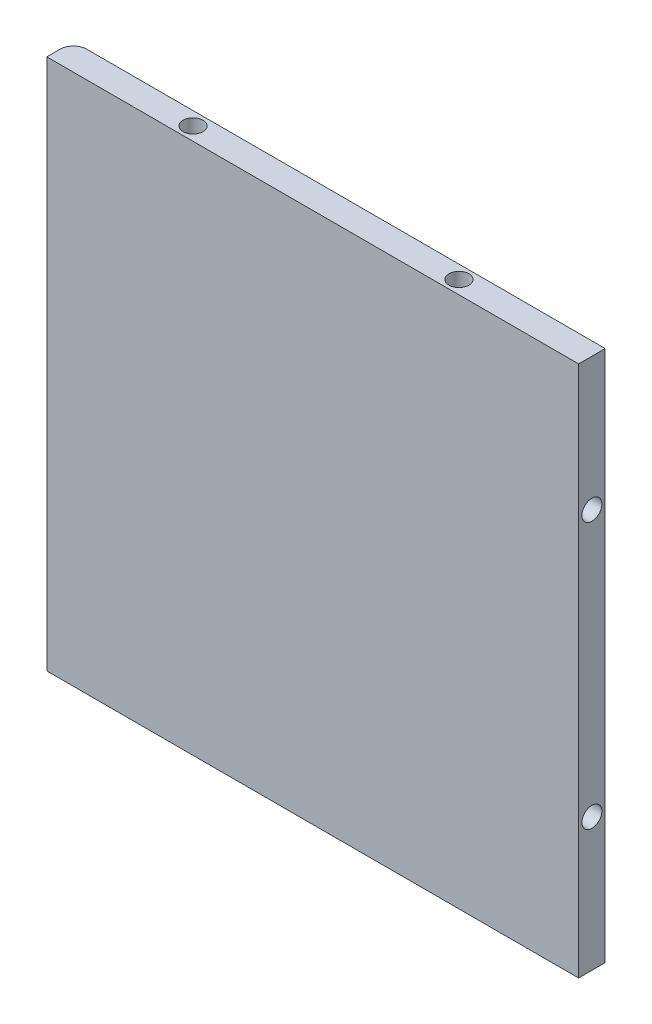
ISO-10303-21;
HEADER;
FILE_DESCRIPTION(('STEP AP214'),'2;1');
FILE_NAME('part.step','',(''),(''),'','','');
FILE_SCHEMA(('AUTOMOTIVE_DESIGN { 1 0 10303 214 1 1 1 1 }'));
ENDSEC;
DATA;
#1=APPLICATION_CONTEXT('core data for automotive mechanical design processes');
#2=APPLICATION_PROTOCOL_DEFINITION('international standard','automotive_design',2000,#1);
#3=PRODUCT_CONTEXT('',#1,'mechanical');
#4=PRODUCT('Part','Part','',(#3));
#5=PRODUCT_RELATED_PRODUCT_CATEGORY('part','',(#4));
#6=PRODUCT_DEFINITION_FORMATION('','',#4);
#7=PRODUCT_DEFINITION_CONTEXT('part definition',#1,'design');
#8=PRODUCT_DEFINITION('design','',#6,#7);
#9=PRODUCT_DEFINITION_SHAPE('','',#8);
#10=(LENGTH_UNIT() NAMED_UNIT(*) SI_UNIT(.MILLI.,.METRE.));
#11=(NAMED_UNIT(*) PLANE_ANGLE_UNIT() SI_UNIT($,.RADIAN.));
#12=(NAMED_UNIT(*) SI_UNIT($,.STERADIAN.) SOLID_ANGLE_UNIT());
#13=UNCERTAINTY_MEASURE_WITH_UNIT(LENGTH_MEASURE(1.E-05),#10,'distance_accuracy_value','');
#14=(GEOMETRIC_REPRESENTATION_CONTEXT(3) GLOBAL_UNCERTAINTY_ASSIGNED_CONTEXT((#13)) GLOBAL_UNIT_ASSIGNED_CONTEXT((#10,
#11,#12)) REPRESENTATION_CONTEXT('',''));
#15=CARTESIAN_POINT('',(0.,0.,0.));
#16=DIRECTION('',(0.,0.,1.));
#17=DIRECTION('',(1.,0.,0.));
#18=AXIS2_PLACEMENT_3D('',#15,#16,#17);
#19=CARTESIAN_POINT('',(80.,0.,-110.));
#20=DIRECTION('',(0.,0.,-1.));
#21=DIRECTION('',(0.,1.,0.));
#22=AXIS2_PLACEMENT_3D('',#19,#20,#21);
#23=PLANE('',#22);
#24=DIRECTION('',(-1.,0.,0.));
#25=VECTOR('',#24,1.);
#26=CARTESIAN_POINT('',(0.,38.,-110.));
#27=LINE('',#26,#25);
#28=CARTESIAN_POINT('',(40.,38.,-110.));
#29=VERTEX_POINT('',#28);
#30=CARTESIAN_POINT('',(1.,38.,-110.));
#31=VERTEX_POINT('',#30);
#32=EDGE_CURVE('E96',#29,#31,#27,.T.);
#33=ORIENTED_EDGE('',*,*,#32,.T.);
#34=DIRECTION('',(0.,-1.,0.));
#35=VECTOR('',#34,1.);
#36=CARTESIAN_POINT('',(1.,108.,-110.));
#37=LINE('',#36,#35);
#38=CARTESIAN_POINT('',(1.,78.,-110.));
#39=VERTEX_POINT('',#38);
#40=EDGE_CURVE('E100',#31,#39,#37,.F.);
#41=ORIENTED_EDGE('',*,*,#40,.T.);
#42=DIRECTION('',(1.,0.,0.));
#43=VECTOR('',#42,1.);
#44=CARTESIAN_POINT('',(0.,78.,-110.));
#45=LINE('',#44,#43);
#46=CARTESIAN_POINT('',(40.,78.,-110.));
#47=VERTEX_POINT('',#46);
#48=EDGE_CURVE('E54',#39,#47,#45,.T.);
#49=ORIENTED_EDGE('',*,*,#48,.T.);
#50=DIRECTION('',(0.,-1.,0.));
#51=VECTOR('',#50,1.);
#52=CARTESIAN_POINT('',(40.,0.,-110.));
#53=LINE('',#52,#51);
#54=EDGE_CURVE('E91',#47,#29,#53,.T.);
#55=ORIENTED_EDGE('',*,*,#54,.T.);
#56=EDGE_LOOP('',(#33,#41,#49,#55));
#57=FACE_BOUND('',#56,.T.);
#58=ADVANCED_FACE('F39',(#57),#23,.T.);
#59=CARTESIAN_POINT('',(80.,0.,-108.));
#60=DIRECTION('',(0.,0.,1.));
#61=DIRECTION('',(1.,0.,0.));
#62=AXIS2_PLACEMENT_3D('',#59,#60,#61);
#63=PLANE('',#62);
#64=DIRECTION('',(-1.,0.,0.));
#65=VECTOR('',#64,1.);
#66=CARTESIAN_POINT('',(80.,38.,-108.));
#67=LINE('',#66,#65);
#68=CARTESIAN_POINT('',(40.,38.,-108.));
#69=VERTEX_POINT('',#68);
#70=CARTESIAN_POINT('',(0.,38.,-108.));
#71=VERTEX_POINT('',#70);
#72=EDGE_CURVE('E117',#69,#71,#67,.T.);
#73=ORIENTED_EDGE('',*,*,#72,.F.);
#74=DIRECTION('',(0.,-1.,0.));
#75=VECTOR('',#74,1.);
#76=CARTESIAN_POINT('',(40.,0.,-108.));
#77=LINE('',#76,#75);
#78=CARTESIAN_POINT('',(40.,78.,-108.));
#79=VERTEX_POINT('',#78);
#80=EDGE_CURVE('E11',#79,#69,#77,.T.);
#81=ORIENTED_EDGE('',*,*,#80,.F.);
#82=DIRECTION('',(1.,0.,0.));
#83=VECTOR('',#82,1.);
#84=CARTESIAN_POINT('',(80.,78.,-108.));
#85=LINE('',#84,#83);
#86=CARTESIAN_POINT('',(0.,78.,-108.));
#87=VERTEX_POINT('',#86);
#88=EDGE_CURVE('E86',#87,#79,#85,.T.);
#89=ORIENTED_EDGE('',*,*,#88,.F.);
#90=DIRECTION('',(0.,1.,0.));
#91=VECTOR('',#90,1.);
#92=CARTESIAN_POINT('',(0.,0.,-108.));
#93=LINE('',#92,#91);
#94=EDGE_CURVE('E119',#71,#87,#93,.T.);
#95=ORIENTED_EDGE('',*,*,#94,.F.);
#96=EDGE_LOOP('',(#73,#81,#89,#95));
#97=FACE_BOUND('',#96,.T.);
#98=ADVANCED_FACE('F138',(#97),#63,.T.);
#99=CARTESIAN_POINT('',(0.,0.,0.));
#100=DIRECTION('',(1.,0.,0.));
#101=DIRECTION('',(0.,0.,-1.));
#102=AXIS2_PLACEMENT_3D('',#99,#100,#101);
#103=PLANE('',#102);
#104=DIRECTION('',(0.,-1.,0.));
#105=VECTOR('',#104,1.);
#106=CARTESIAN_POINT('',(0.,-1.99999999999999,-109.));
#107=LINE('',#106,#105);
#108=CARTESIAN_POINT('',(0.,78.,-109.));
#109=VERTEX_POINT('',#108);
#110=CARTESIAN_POINT('',(0.,38.,-109.));
#111=VERTEX_POINT('',#110);
#112=EDGE_CURVE('E122',#109,#111,#107,.T.);
#113=ORIENTED_EDGE('',*,*,#112,.T.);
#114=DIRECTION('',(0.,0.,1.));
#115=VECTOR('',#114,1.);
#116=CARTESIAN_POINT('',(0.,38.,-110.));
#117=LINE('',#116,#115);
#118=EDGE_CURVE('E111',#111,#71,#117,.T.);
#119=ORIENTED_EDGE('',*,*,#118,.T.);
#120=ORIENTED_EDGE('',*,*,#94,.T.);
#121=DIRECTION('',(0.,0.,1.));
#122=VECTOR('',#121,1.);
#123=CARTESIAN_POINT('',(0.,78.,-110.));
#124=LINE('',#123,#122);
#125=EDGE_CURVE('E88',#109,#87,#124,.T.);
#126=ORIENTED_EDGE('',*,*,#125,.F.);
#127=EDGE_LOOP('',(#113,#119,#120,#126));
#128=FACE_BOUND('',#127,.T.);
#129=ADVANCED_FACE('F134',(#128),#103,.F.);
#130=CARTESIAN_POINT('',(1.,0.,-109.));
#131=DIRECTION('',(0.,1.,0.));
#132=DIRECTION('',(0.,0.,1.));
#133=AXIS2_PLACEMENT_3D('',#130,#131,#132);
#134=CYLINDRICAL_SURFACE('',#133,1.);
#135=CARTESIAN_POINT('',(1.,38.,-109.));
#136=DIRECTION('',(0.,1.,0.));
#137=DIRECTION('',(0.,0.,1.));
#138=AXIS2_PLACEMENT_3D('',#135,#136,#137);
#139=CIRCLE('',#138,1.);
#140=EDGE_CURVE('E47',#111,#31,#139,.F.);
#141=ORIENTED_EDGE('',*,*,#140,.F.);
#142=ORIENTED_EDGE('',*,*,#112,.F.);
#143=CARTESIAN_POINT('',(1.,78.,-109.));
#144=DIRECTION('',(0.,-1.,0.));
#145=DIRECTION('',(0.,0.,-1.));
#146=AXIS2_PLACEMENT_3D('',#143,#144,#145);
#147=CIRCLE('',#146,1.);
#148=EDGE_CURVE('E126',#39,#109,#147,.F.);
#149=ORIENTED_EDGE('',*,*,#148,.F.);
#150=ORIENTED_EDGE('',*,*,#40,.F.);
#151=EDGE_LOOP('',(#141,#142,#149,#150));
#152=FACE_BOUND('',#151,.T.);
#153=ADVANCED_FACE('F41',(#152),#134,.T.);
#154=CARTESIAN_POINT('',(0.,38.,-110.));
#155=DIRECTION('',(0.,1.,0.));
#156=DIRECTION('',(0.,0.,1.));
#157=AXIS2_PLACEMENT_3D('',#154,#155,#156);
#158=PLANE('',#157);
#159=CARTESIAN_POINT('',(9.99999999999998,38.,-109.));
#160=DIRECTION('',(0.,-1.,0.));
#161=DIRECTION('',(1.,0.,0.));
#162=AXIS2_PLACEMENT_3D('',#159,#160,#161);
#163=CIRCLE('',#162,0.75);
#164=CARTESIAN_POINT('',(10.75,38.,-109.));
#165=VERTEX_POINT('',#164);
#166=EDGE_CURVE('E226',#165,#165,#163,.T.);
#167=ORIENTED_EDGE('',*,*,#166,.F.);
#168=EDGE_LOOP('',(#167));
#169=FACE_BOUND('',#168,.T.);
#170=CARTESIAN_POINT('',(30.,38.,-109.));
#171=DIRECTION('',(0.,-1.,0.));
#172=DIRECTION('',(1.,0.,0.));
#173=AXIS2_PLACEMENT_3D('',#170,#171,#172);
#174=CIRCLE('',#173,0.750000000000002);
#175=CARTESIAN_POINT('',(30.75,38.,-109.));
#176=VERTEX_POINT('',#175);
#177=EDGE_CURVE('E212',#176,#176,#174,.T.);
#178=ORIENTED_EDGE('',*,*,#177,.F.);
#179=EDGE_LOOP('',(#178));
#180=FACE_BOUND('',#179,.T.);
#181=ORIENTED_EDGE('',*,*,#72,.T.);
#182=ORIENTED_EDGE('',*,*,#118,.F.);
#183=ORIENTED_EDGE('',*,*,#140,.T.);
#184=ORIENTED_EDGE('',*,*,#32,.F.);
#185=DIRECTION('',(0.,0.,1.));
#186=VECTOR('',#185,1.);
#187=CARTESIAN_POINT('',(40.,38.,-110.));
#188=LINE('',#187,#186);
#189=EDGE_CURVE('E87',#29,#69,#188,.T.);
#190=ORIENTED_EDGE('',*,*,#189,.T.);
#191=EDGE_LOOP('',(#181,#182,#183,#184,#190));
#192=FACE_BOUND('',#191,.T.);
#193=ADVANCED_FACE('F129',(#169,#180,#192),#158,.F.);
#194=CARTESIAN_POINT('',(40.,0.,-110.));
#195=DIRECTION('',(-1.,0.,0.));
#196=DIRECTION('',(0.,-1.,0.));
#197=AXIS2_PLACEMENT_3D('',#194,#195,#196);
#198=PLANE('',#197);
#199=CARTESIAN_POINT('',(40.,68.,-109.));
#200=DIRECTION('',(1.,0.,0.));
#201=DIRECTION('',(0.,0.,-1.));
#202=AXIS2_PLACEMENT_3D('',#199,#200,#201);
#203=CIRCLE('',#202,0.749999999999999);
#204=CARTESIAN_POINT('',(40.,68.,-109.75));
#205=VERTEX_POINT('',#204);
#206=EDGE_CURVE('E209',#205,#205,#203,.T.);
#207=ORIENTED_EDGE('',*,*,#206,.F.);
#208=EDGE_LOOP('',(#207));
#209=FACE_BOUND('',#208,.T.);
#210=CARTESIAN_POINT('',(40.,48.,-109.));
#211=DIRECTION('',(1.,0.,0.));
#212=DIRECTION('',(0.,0.,-1.));
#213=AXIS2_PLACEMENT_3D('',#210,#211,#212);
#214=CIRCLE('',#213,0.749999999999999);
#215=CARTESIAN_POINT('',(40.,48.,-109.75));
#216=VERTEX_POINT('',#215);
#217=EDGE_CURVE('E215',#216,#216,#214,.T.);
#218=ORIENTED_EDGE('',*,*,#217,.F.);
#219=EDGE_LOOP('',(#218));
#220=FACE_BOUND('',#219,.T.);
#221=ORIENTED_EDGE('',*,*,#80,.T.);
#222=ORIENTED_EDGE('',*,*,#189,.F.);
#223=ORIENTED_EDGE('',*,*,#54,.F.);
#224=DIRECTION('',(0.,0.,1.));
#225=VECTOR('',#224,1.);
#226=CARTESIAN_POINT('',(40.,78.,-110.));
#227=LINE('',#226,#225);
#228=EDGE_CURVE('E82',#47,#79,#227,.T.);
#229=ORIENTED_EDGE('',*,*,#228,.T.);
#230=EDGE_LOOP('',(#221,#222,#223,#229));
#231=FACE_BOUND('',#230,.T.);
#232=ADVANCED_FACE('F92',(#209,#220,#231),#198,.F.);
#233=CARTESIAN_POINT('',(0.,78.,-110.));
#234=DIRECTION('',(0.,-1.,0.));
#235=DIRECTION('',(0.,0.,-1.));
#236=AXIS2_PLACEMENT_3D('',#233,#234,#235);
#237=PLANE('',#236);
#238=CARTESIAN_POINT('',(10.,78.,-109.));
#239=DIRECTION('',(0.,1.,0.));
#240=DIRECTION('',(0.,0.,1.));
#241=AXIS2_PLACEMENT_3D('',#238,#239,#240);
#242=CIRCLE('',#241,0.749999999999999);
#243=CARTESIAN_POINT('',(10.,78.,-108.25));
#244=VERTEX_POINT('',#243);
#245=EDGE_CURVE('E104',#244,#244,#242,.T.);
#246=ORIENTED_EDGE('',*,*,#245,.F.);
#247=EDGE_LOOP('',(#246));
#248=FACE_BOUND('',#247,.T.);
#249=CARTESIAN_POINT('',(30.,78.,-109.));
#250=DIRECTION('',(0.,1.,0.));
#251=DIRECTION('',(0.,0.,1.));
#252=AXIS2_PLACEMENT_3D('',#249,#250,#251);
#253=CIRCLE('',#252,0.750000000000002);
#254=CARTESIAN_POINT('',(30.,78.,-108.25));
#255=VERTEX_POINT('',#254);
#256=EDGE_CURVE('E232',#255,#255,#253,.T.);
#257=ORIENTED_EDGE('',*,*,#256,.F.);
#258=EDGE_LOOP('',(#257));
#259=FACE_BOUND('',#258,.T.);
#260=ORIENTED_EDGE('',*,*,#88,.T.);
#261=ORIENTED_EDGE('',*,*,#228,.F.);
#262=ORIENTED_EDGE('',*,*,#48,.F.);
#263=ORIENTED_EDGE('',*,*,#148,.T.);
#264=ORIENTED_EDGE('',*,*,#125,.T.);
#265=EDGE_LOOP('',(#260,#261,#262,#263,#264));
#266=FACE_BOUND('',#265,.T.);
#267=ADVANCED_FACE('F84',(#248,#259,#266),#237,.F.);
#268=CARTESIAN_POINT('',(30.,73.,-109.));
#269=DIRECTION('',(0.,1.,0.));
#270=DIRECTION('',(0.,0.,1.));
#271=AXIS2_PLACEMENT_3D('',#268,#269,#270);
#272=CYLINDRICAL_SURFACE('',#271,0.750000000000002);
#273=CARTESIAN_POINT('',(30.,73.,-109.));
#274=DIRECTION('',(0.,1.,0.));
#275=DIRECTION('',(0.,0.,1.));
#276=AXIS2_PLACEMENT_3D('',#273,#274,#275);
#277=CIRCLE('',#276,0.750000000000002);
#278=CARTESIAN_POINT('',(30.,73.,-108.25));
#279=VERTEX_POINT('',#278);
#280=EDGE_CURVE('E107',#279,#279,#277,.T.);
#281=ORIENTED_EDGE('',*,*,#280,.F.);
#282=EDGE_LOOP('',(#281));
#283=FACE_BOUND('',#282,.T.);
#284=ORIENTED_EDGE('',*,*,#256,.T.);
#285=EDGE_LOOP('',(#284));
#286=FACE_BOUND('',#285,.T.);
#287=ADVANCED_FACE('F149',(#283,#286),#272,.F.);
#288=CARTESIAN_POINT('',(30.,73.,-109.));
#289=DIRECTION('',(0.,1.,0.));
#290=DIRECTION('',(0.,0.,1.));
#291=AXIS2_PLACEMENT_3D('',#288,#289,#290);
#292=PLANE('',#291);
#293=ORIENTED_EDGE('',*,*,#280,.T.);
#294=EDGE_LOOP('',(#293));
#295=FACE_BOUND('',#294,.T.);
#296=ADVANCED_FACE('F157',(#295),#292,.T.);
#297=CARTESIAN_POINT('',(10.,73.,-109.));
#298=DIRECTION('',(0.,1.,0.));
#299=DIRECTION('',(0.,0.,1.));
#300=AXIS2_PLACEMENT_3D('',#297,#298,#299);
#301=CYLINDRICAL_SURFACE('',#300,0.749999999999999);
#302=CARTESIAN_POINT('',(10.,73.,-109.));
#303=DIRECTION('',(0.,1.,0.));
#304=DIRECTION('',(0.,0.,1.));
#305=AXIS2_PLACEMENT_3D('',#302,#303,#304);
#306=CIRCLE('',#305,0.749999999999999);
#307=CARTESIAN_POINT('',(10.,73.,-108.25));
#308=VERTEX_POINT('',#307);
#309=EDGE_CURVE('E101',#308,#308,#306,.T.);
#310=ORIENTED_EDGE('',*,*,#309,.F.);
#311=EDGE_LOOP('',(#310));
#312=FACE_BOUND('',#311,.T.);
#313=ORIENTED_EDGE('',*,*,#245,.T.);
#314=EDGE_LOOP('',(#313));
#315=FACE_BOUND('',#314,.T.);
#316=ADVANCED_FACE('F160',(#312,#315),#301,.F.);
#317=CARTESIAN_POINT('',(10.,73.,-109.));
#318=DIRECTION('',(0.,1.,0.));
#319=DIRECTION('',(0.,0.,1.));
#320=AXIS2_PLACEMENT_3D('',#317,#318,#319);
#321=PLANE('',#320);
#322=ORIENTED_EDGE('',*,*,#309,.T.);
#323=EDGE_LOOP('',(#322));
#324=FACE_BOUND('',#323,.T.);
#325=ADVANCED_FACE('F167',(#324),#321,.T.);
#326=CARTESIAN_POINT('',(30.,43.,-109.));
#327=DIRECTION('',(0.,-1.,0.));
#328=DIRECTION('',(1.,0.,0.));
#329=AXIS2_PLACEMENT_3D('',#326,#327,#328);
#330=CYLINDRICAL_SURFACE('',#329,0.750000000000002);
#331=CARTESIAN_POINT('',(30.,43.,-109.));
#332=DIRECTION('',(0.,-1.,0.));
#333=DIRECTION('',(1.,0.,0.));
#334=AXIS2_PLACEMENT_3D('',#331,#332,#333);
#335=CIRCLE('',#334,0.750000000000002);
#336=CARTESIAN_POINT('',(30.75,43.,-109.));
#337=VERTEX_POINT('',#336);
#338=EDGE_CURVE('E208',#337,#337,#335,.T.);
#339=ORIENTED_EDGE('',*,*,#338,.F.);
#340=EDGE_LOOP('',(#339));
#341=FACE_BOUND('',#340,.T.);
#342=ORIENTED_EDGE('',*,*,#177,.T.);
#343=EDGE_LOOP('',(#342));
#344=FACE_BOUND('',#343,.T.);
#345=ADVANCED_FACE('F171',(#341,#344),#330,.F.);
#346=CARTESIAN_POINT('',(30.,43.,-109.));
#347=DIRECTION('',(0.,-1.,0.));
#348=DIRECTION('',(1.,0.,0.));
#349=AXIS2_PLACEMENT_3D('',#346,#347,#348);
#350=PLANE('',#349);
#351=ORIENTED_EDGE('',*,*,#338,.T.);
#352=EDGE_LOOP('',(#351));
#353=FACE_BOUND('',#352,.T.);
#354=ADVANCED_FACE('F173',(#353),#350,.T.);
#355=CARTESIAN_POINT('',(9.99999999999998,43.,-109.));
#356=DIRECTION('',(0.,-1.,0.));
#357=DIRECTION('',(1.,0.,0.));
#358=AXIS2_PLACEMENT_3D('',#355,#356,#357);
#359=CYLINDRICAL_SURFACE('',#358,0.75);
#360=CARTESIAN_POINT('',(9.99999999999998,43.,-109.));
#361=DIRECTION('',(0.,-1.,0.));
#362=DIRECTION('',(1.,0.,0.));
#363=AXIS2_PLACEMENT_3D('',#360,#361,#362);
#364=CIRCLE('',#363,0.75);
#365=CARTESIAN_POINT('',(10.75,43.,-109.));
#366=VERTEX_POINT('',#365);
#367=EDGE_CURVE('E223',#366,#366,#364,.T.);
#368=ORIENTED_EDGE('',*,*,#367,.F.);
#369=EDGE_LOOP('',(#368));
#370=FACE_BOUND('',#369,.T.);
#371=ORIENTED_EDGE('',*,*,#166,.T.);
#372=EDGE_LOOP('',(#371));
#373=FACE_BOUND('',#372,.T.);
#374=ADVANCED_FACE('F176',(#370,#373),#359,.F.);
#375=CARTESIAN_POINT('',(9.99999999999998,43.,-109.));
#376=DIRECTION('',(0.,-1.,0.));
#377=DIRECTION('',(1.,0.,0.));
#378=AXIS2_PLACEMENT_3D('',#375,#376,#377);
#379=PLANE('',#378);
#380=ORIENTED_EDGE('',*,*,#367,.T.);
#381=EDGE_LOOP('',(#380));
#382=FACE_BOUND('',#381,.T.);
#383=ADVANCED_FACE('F183',(#382),#379,.T.);
#384=CARTESIAN_POINT('',(35.,48.,-109.));
#385=DIRECTION('',(1.,0.,0.));
#386=DIRECTION('',(0.,0.,-1.));
#387=AXIS2_PLACEMENT_3D('',#384,#385,#386);
#388=CYLINDRICAL_SURFACE('',#387,0.749999999999999);
#389=CARTESIAN_POINT('',(35.,48.,-109.));
#390=DIRECTION('',(1.,0.,0.));
#391=DIRECTION('',(0.,0.,-1.));
#392=AXIS2_PLACEMENT_3D('',#389,#390,#391);
#393=CIRCLE('',#392,0.749999999999999);
#394=CARTESIAN_POINT('',(35.,48.,-109.75));
#395=VERTEX_POINT('',#394);
#396=EDGE_CURVE('E220',#395,#395,#393,.T.);
#397=ORIENTED_EDGE('',*,*,#396,.F.);
#398=EDGE_LOOP('',(#397));
#399=FACE_BOUND('',#398,.T.);
#400=ORIENTED_EDGE('',*,*,#217,.T.);
#401=EDGE_LOOP('',(#400));
#402=FACE_BOUND('',#401,.T.);
#403=ADVANCED_FACE('F187',(#399,#402),#388,.F.);
#404=CARTESIAN_POINT('',(35.,48.,-109.));
#405=DIRECTION('',(1.,0.,0.));
#406=DIRECTION('',(0.,0.,-1.));
#407=AXIS2_PLACEMENT_3D('',#404,#405,#406);
#408=PLANE('',#407);
#409=ORIENTED_EDGE('',*,*,#396,.T.);
#410=EDGE_LOOP('',(#409));
#411=FACE_BOUND('',#410,.T.);
#412=ADVANCED_FACE('F189',(#411),#408,.T.);
#413=CARTESIAN_POINT('',(35.,68.,-109.));
#414=DIRECTION('',(1.,0.,0.));
#415=DIRECTION('',(0.,0.,-1.));
#416=AXIS2_PLACEMENT_3D('',#413,#414,#415);
#417=CYLINDRICAL_SURFACE('',#416,0.749999999999999);
#418=CARTESIAN_POINT('',(35.,68.,-109.));
#419=DIRECTION('',(1.,0.,0.));
#420=DIRECTION('',(0.,0.,-1.));
#421=AXIS2_PLACEMENT_3D('',#418,#419,#420);
#422=CIRCLE('',#421,0.749999999999999);
#423=CARTESIAN_POINT('',(35.,68.,-109.75));
#424=VERTEX_POINT('',#423);
#425=EDGE_CURVE('E207',#424,#424,#422,.T.);
#426=ORIENTED_EDGE('',*,*,#425,.F.);
#427=EDGE_LOOP('',(#426));
#428=FACE_BOUND('',#427,.T.);
#429=ORIENTED_EDGE('',*,*,#206,.T.);
#430=EDGE_LOOP('',(#429));
#431=FACE_BOUND('',#430,.T.);
#432=ADVANCED_FACE('F192',(#428,#431),#417,.F.);
#433=CARTESIAN_POINT('',(35.,68.,-109.));
#434=DIRECTION('',(1.,0.,0.));
#435=DIRECTION('',(0.,0.,-1.));
#436=AXIS2_PLACEMENT_3D('',#433,#434,#435);
#437=PLANE('',#436);
#438=ORIENTED_EDGE('',*,*,#425,.T.);
#439=EDGE_LOOP('',(#438));
#440=FACE_BOUND('',#439,.T.);
#441=ADVANCED_FACE('F199',(#440),#437,.T.);
#442=CLOSED_SHELL('',(#58,#98,#129,#153,#193,#232,#267,#287,#296,#316,#325,#345,#354,#374,#383,
#403,#412,#432,#441));
#443=MANIFOLD_SOLID_BREP('B2',#442);
#444=ADVANCED_BREP_SHAPE_REPRESENTATION('',(#18,#443),#14);
#445=SHAPE_DEFINITION_REPRESENTATION(#9,#444);
ENDSEC;
END-ISO-10303-21;
